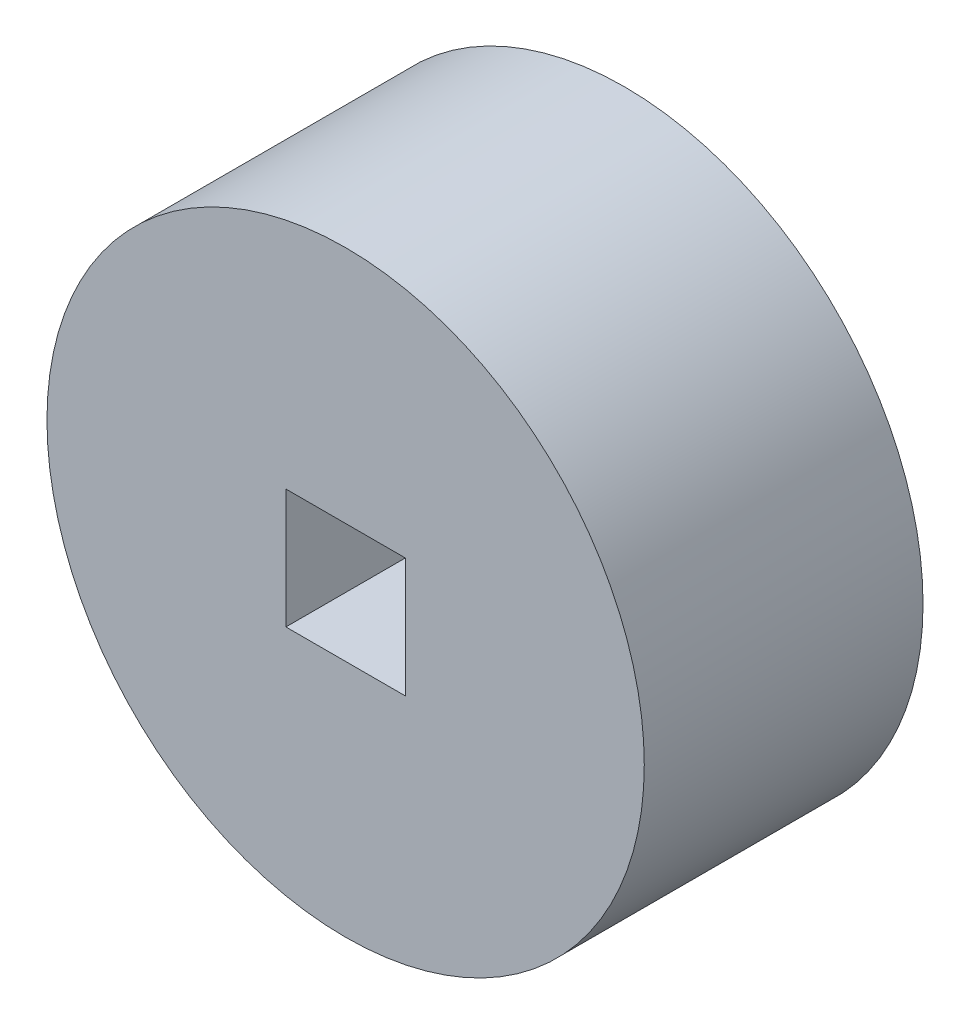
ISO-10303-21;
HEADER;
FILE_DESCRIPTION(('STEP AP214'),'2;1');
FILE_NAME('part.step','',(''),(''),'','','');
FILE_SCHEMA(('AUTOMOTIVE_DESIGN { 1 0 10303 214 1 1 1 1 }'));
ENDSEC;
DATA;
#1=APPLICATION_CONTEXT('core data for automotive mechanical design processes');
#2=APPLICATION_PROTOCOL_DEFINITION('international standard','automotive_design',2000,#1);
#3=PRODUCT_CONTEXT('',#1,'mechanical');
#4=PRODUCT('Part','Part','',(#3));
#5=PRODUCT_RELATED_PRODUCT_CATEGORY('part','',(#4));
#6=PRODUCT_DEFINITION_FORMATION('','',#4);
#7=PRODUCT_DEFINITION_CONTEXT('part definition',#1,'design');
#8=PRODUCT_DEFINITION('design','',#6,#7);
#9=PRODUCT_DEFINITION_SHAPE('','',#8);
#10=(LENGTH_UNIT() NAMED_UNIT(*) SI_UNIT(.MILLI.,.METRE.));
#11=(NAMED_UNIT(*) PLANE_ANGLE_UNIT() SI_UNIT($,.RADIAN.));
#12=(NAMED_UNIT(*) SI_UNIT($,.STERADIAN.) SOLID_ANGLE_UNIT());
#13=UNCERTAINTY_MEASURE_WITH_UNIT(LENGTH_MEASURE(1.E-05),#10,'distance_accuracy_value','');
#14=(GEOMETRIC_REPRESENTATION_CONTEXT(3) GLOBAL_UNCERTAINTY_ASSIGNED_CONTEXT((#13)) GLOBAL_UNIT_ASSIGNED_CONTEXT((#10,
#11,#12)) REPRESENTATION_CONTEXT('',''));
#15=CARTESIAN_POINT('',(0.,0.,0.));
#16=DIRECTION('',(0.,0.,1.));
#17=DIRECTION('',(1.,0.,0.));
#18=AXIS2_PLACEMENT_3D('',#15,#16,#17);
#19=CARTESIAN_POINT('',(0.,0.,7.));
#20=DIRECTION('',(0.,0.,-1.));
#21=DIRECTION('',(-1.,0.,0.));
#22=AXIS2_PLACEMENT_3D('',#19,#20,#21);
#23=CYLINDRICAL_SURFACE('',#22,7.5);
#24=CARTESIAN_POINT('',(0.,0.,7.));
#25=DIRECTION('',(0.,0.,1.));
#26=DIRECTION('',(1.,0.,0.));
#27=AXIS2_PLACEMENT_3D('',#24,#25,#26);
#28=CIRCLE('',#27,7.5);
#29=CARTESIAN_POINT('',(7.5,0.,7.));
#30=VERTEX_POINT('',#29);
#31=EDGE_CURVE('E11',#30,#30,#28,.T.);
#32=ORIENTED_EDGE('',*,*,#31,.F.);
#33=EDGE_LOOP('',(#32));
#34=FACE_BOUND('',#33,.T.);
#35=CARTESIAN_POINT('',(0.,0.,0.));
#36=DIRECTION('',(0.,0.,1.));
#37=DIRECTION('',(1.,0.,0.));
#38=AXIS2_PLACEMENT_3D('',#35,#36,#37);
#39=CIRCLE('',#38,7.5);
#40=CARTESIAN_POINT('',(7.5,0.,0.));
#41=VERTEX_POINT('',#40);
#42=EDGE_CURVE('E36',#41,#41,#39,.T.);
#43=ORIENTED_EDGE('',*,*,#42,.T.);
#44=EDGE_LOOP('',(#43));
#45=FACE_BOUND('',#44,.T.);
#46=ADVANCED_FACE('F33',(#34,#45),#23,.T.);
#47=CARTESIAN_POINT('',(0.,0.,7.));
#48=DIRECTION('',(0.,0.,1.));
#49=DIRECTION('',(1.,0.,0.));
#50=AXIS2_PLACEMENT_3D('',#47,#48,#49);
#51=PLANE('',#50);
#52=DIRECTION('',(0.,1.,0.));
#53=VECTOR('',#52,1.);
#54=CARTESIAN_POINT('',(-1.5,-1.5,7.));
#55=LINE('',#54,#53);
#56=CARTESIAN_POINT('',(-1.5,-1.5,7.));
#57=VERTEX_POINT('',#56);
#58=CARTESIAN_POINT('',(-1.5,1.5,7.));
#59=VERTEX_POINT('',#58);
#60=EDGE_CURVE('E75',#57,#59,#55,.T.);
#61=ORIENTED_EDGE('',*,*,#60,.T.);
#62=DIRECTION('',(1.,0.,0.));
#63=VECTOR('',#62,1.);
#64=CARTESIAN_POINT('',(1.5,1.5,7.));
#65=LINE('',#64,#63);
#66=CARTESIAN_POINT('',(1.5,1.5,7.));
#67=VERTEX_POINT('',#66);
#68=EDGE_CURVE('E84',#59,#67,#65,.T.);
#69=ORIENTED_EDGE('',*,*,#68,.T.);
#70=DIRECTION('',(0.,-1.,0.));
#71=VECTOR('',#70,1.);
#72=CARTESIAN_POINT('',(1.5,-1.5,7.));
#73=LINE('',#72,#71);
#74=CARTESIAN_POINT('',(1.5,-1.5,7.));
#75=VERTEX_POINT('',#74);
#76=EDGE_CURVE('E47',#67,#75,#73,.T.);
#77=ORIENTED_EDGE('',*,*,#76,.T.);
#78=DIRECTION('',(-1.,0.,0.));
#79=VECTOR('',#78,1.);
#80=CARTESIAN_POINT('',(1.5,-1.5,7.));
#81=LINE('',#80,#79);
#82=EDGE_CURVE('E81',#75,#57,#81,.T.);
#83=ORIENTED_EDGE('',*,*,#82,.T.);
#84=EDGE_LOOP('',(#61,#69,#77,#83));
#85=FACE_BOUND('',#84,.T.);
#86=ORIENTED_EDGE('',*,*,#31,.T.);
#87=EDGE_LOOP('',(#86));
#88=FACE_BOUND('',#87,.T.);
#89=ADVANCED_FACE('F88',(#85,#88),#51,.T.);
#90=CARTESIAN_POINT('',(0.,0.,0.));
#91=DIRECTION('',(0.,0.,1.));
#92=DIRECTION('',(1.,0.,0.));
#93=AXIS2_PLACEMENT_3D('',#90,#91,#92);
#94=PLANE('',#93);
#95=DIRECTION('',(1.,0.,0.));
#96=VECTOR('',#95,1.);
#97=CARTESIAN_POINT('',(1.5,1.5,0.));
#98=LINE('',#97,#96);
#99=CARTESIAN_POINT('',(-1.5,1.5,0.));
#100=VERTEX_POINT('',#99);
#101=CARTESIAN_POINT('',(1.5,1.5,0.));
#102=VERTEX_POINT('',#101);
#103=EDGE_CURVE('E100',#100,#102,#98,.T.);
#104=ORIENTED_EDGE('',*,*,#103,.F.);
#105=DIRECTION('',(0.,1.,0.));
#106=VECTOR('',#105,1.);
#107=CARTESIAN_POINT('',(-1.5,-1.5,0.));
#108=LINE('',#107,#106);
#109=CARTESIAN_POINT('',(-1.5,-1.5,0.));
#110=VERTEX_POINT('',#109);
#111=EDGE_CURVE('E55',#110,#100,#108,.T.);
#112=ORIENTED_EDGE('',*,*,#111,.F.);
#113=DIRECTION('',(-1.,0.,0.));
#114=VECTOR('',#113,1.);
#115=CARTESIAN_POINT('',(1.5,-1.5,0.));
#116=LINE('',#115,#114);
#117=CARTESIAN_POINT('',(1.5,-1.5,0.));
#118=VERTEX_POINT('',#117);
#119=EDGE_CURVE('E91',#118,#110,#116,.T.);
#120=ORIENTED_EDGE('',*,*,#119,.F.);
#121=DIRECTION('',(0.,-1.,0.));
#122=VECTOR('',#121,1.);
#123=CARTESIAN_POINT('',(1.5,-1.5,0.));
#124=LINE('',#123,#122);
#125=EDGE_CURVE('E94',#102,#118,#124,.T.);
#126=ORIENTED_EDGE('',*,*,#125,.F.);
#127=EDGE_LOOP('',(#104,#112,#120,#126));
#128=FACE_BOUND('',#127,.T.);
#129=ORIENTED_EDGE('',*,*,#42,.F.);
#130=EDGE_LOOP('',(#129));
#131=FACE_BOUND('',#130,.T.);
#132=ADVANCED_FACE('F112',(#128,#131),#94,.F.);
#133=CARTESIAN_POINT('',(-1.5,-1.5,7.));
#134=DIRECTION('',(-1.,0.,0.));
#135=DIRECTION('',(0.,0.,1.));
#136=AXIS2_PLACEMENT_3D('',#133,#134,#135);
#137=PLANE('',#136);
#138=ORIENTED_EDGE('',*,*,#111,.T.);
#139=DIRECTION('',(0.,0.,-1.));
#140=VECTOR('',#139,1.);
#141=CARTESIAN_POINT('',(-1.5,1.5,7.));
#142=LINE('',#141,#140);
#143=EDGE_CURVE('E71',#59,#100,#142,.T.);
#144=ORIENTED_EDGE('',*,*,#143,.F.);
#145=ORIENTED_EDGE('',*,*,#60,.F.);
#146=DIRECTION('',(0.,0.,-1.));
#147=VECTOR('',#146,1.);
#148=CARTESIAN_POINT('',(-1.5,-1.5,7.));
#149=LINE('',#148,#147);
#150=EDGE_CURVE('E104',#57,#110,#149,.T.);
#151=ORIENTED_EDGE('',*,*,#150,.T.);
#152=EDGE_LOOP('',(#138,#144,#145,#151));
#153=FACE_BOUND('',#152,.T.);
#154=ADVANCED_FACE('F73',(#153),#137,.F.);
#155=CARTESIAN_POINT('',(1.5,-1.5,7.));
#156=DIRECTION('',(0.,-1.,0.));
#157=DIRECTION('',(0.,0.,-1.));
#158=AXIS2_PLACEMENT_3D('',#155,#156,#157);
#159=PLANE('',#158);
#160=ORIENTED_EDGE('',*,*,#119,.T.);
#161=ORIENTED_EDGE('',*,*,#150,.F.);
#162=ORIENTED_EDGE('',*,*,#82,.F.);
#163=DIRECTION('',(0.,0.,-1.));
#164=VECTOR('',#163,1.);
#165=CARTESIAN_POINT('',(1.5,-1.5,7.));
#166=LINE('',#165,#164);
#167=EDGE_CURVE('E106',#75,#118,#166,.T.);
#168=ORIENTED_EDGE('',*,*,#167,.T.);
#169=EDGE_LOOP('',(#160,#161,#162,#168));
#170=FACE_BOUND('',#169,.T.);
#171=ADVANCED_FACE('F115',(#170),#159,.F.);
#172=CARTESIAN_POINT('',(1.5,-1.5,7.));
#173=DIRECTION('',(1.,0.,0.));
#174=DIRECTION('',(0.,0.,-1.));
#175=AXIS2_PLACEMENT_3D('',#172,#173,#174);
#176=PLANE('',#175);
#177=ORIENTED_EDGE('',*,*,#125,.T.);
#178=ORIENTED_EDGE('',*,*,#167,.F.);
#179=ORIENTED_EDGE('',*,*,#76,.F.);
#180=DIRECTION('',(0.,0.,-1.));
#181=VECTOR('',#180,1.);
#182=CARTESIAN_POINT('',(1.5,1.5,7.));
#183=LINE('',#182,#181);
#184=EDGE_CURVE('E80',#67,#102,#183,.T.);
#185=ORIENTED_EDGE('',*,*,#184,.T.);
#186=EDGE_LOOP('',(#177,#178,#179,#185));
#187=FACE_BOUND('',#186,.T.);
#188=ADVANCED_FACE('F108',(#187),#176,.F.);
#189=CARTESIAN_POINT('',(1.5,1.5,7.));
#190=DIRECTION('',(0.,1.,0.));
#191=DIRECTION('',(0.,0.,1.));
#192=AXIS2_PLACEMENT_3D('',#189,#190,#191);
#193=PLANE('',#192);
#194=ORIENTED_EDGE('',*,*,#103,.T.);
#195=ORIENTED_EDGE('',*,*,#184,.F.);
#196=ORIENTED_EDGE('',*,*,#68,.F.);
#197=ORIENTED_EDGE('',*,*,#143,.T.);
#198=EDGE_LOOP('',(#194,#195,#196,#197));
#199=FACE_BOUND('',#198,.T.);
#200=ADVANCED_FACE('F85',(#199),#193,.F.);
#201=CLOSED_SHELL('',(#46,#89,#132,#154,#171,#188,#200));
#202=MANIFOLD_SOLID_BREP('B2',#201);
#203=ADVANCED_BREP_SHAPE_REPRESENTATION('',(#18,#202),#14);
#204=SHAPE_DEFINITION_REPRESENTATION(#9,#203);
ENDSEC;
END-ISO-10303-21;
